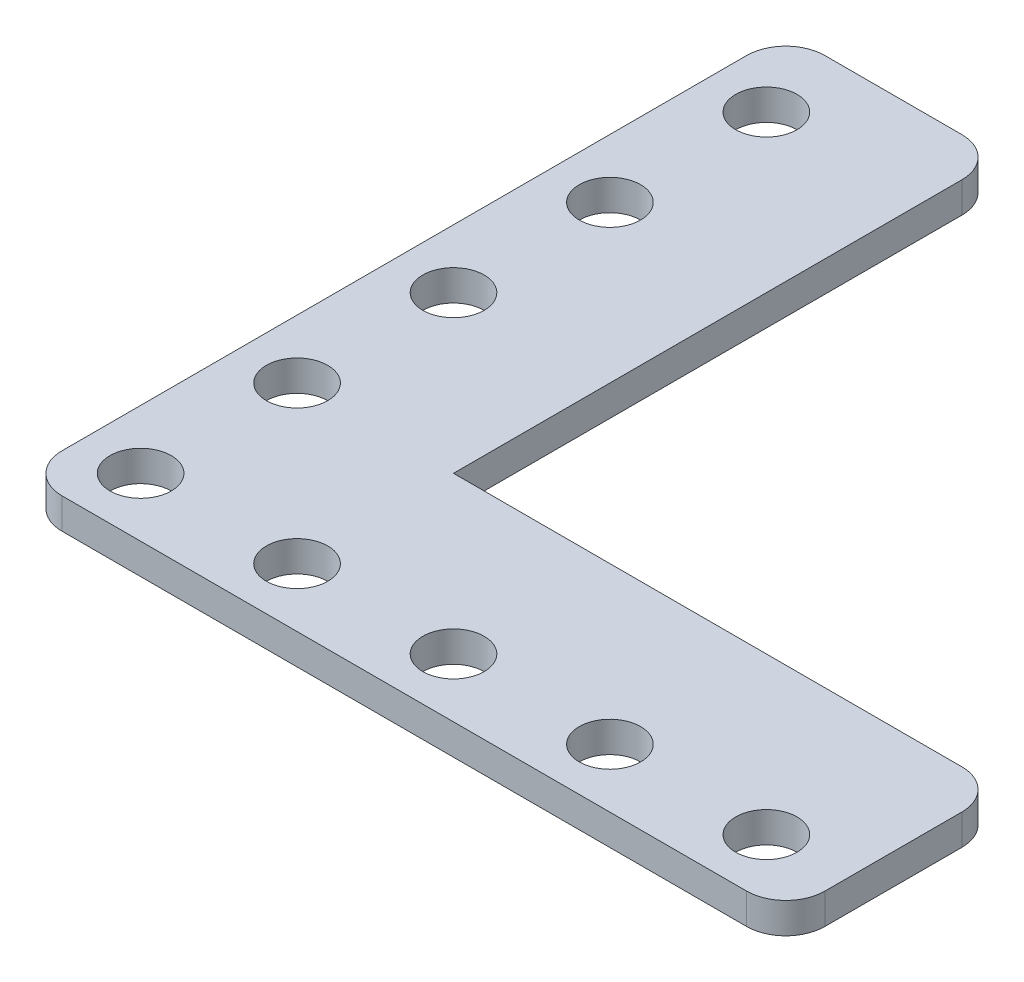
ISO-10303-21;
HEADER;
FILE_DESCRIPTION(('STEP AP214'),'2;1');
FILE_NAME('part.step','',(''),(''),'','','');
FILE_SCHEMA(('AUTOMOTIVE_DESIGN { 1 0 10303 214 1 1 1 1 }'));
ENDSEC;
DATA;
#1=APPLICATION_CONTEXT('core data for automotive mechanical design processes');
#2=APPLICATION_PROTOCOL_DEFINITION('international standard','automotive_design',2000,#1);
#3=PRODUCT_CONTEXT('',#1,'mechanical');
#4=PRODUCT('Part','Part','',(#3));
#5=PRODUCT_RELATED_PRODUCT_CATEGORY('part','',(#4));
#6=PRODUCT_DEFINITION_FORMATION('','',#4);
#7=PRODUCT_DEFINITION_CONTEXT('part definition',#1,'design');
#8=PRODUCT_DEFINITION('design','',#6,#7);
#9=PRODUCT_DEFINITION_SHAPE('','',#8);
#10=(LENGTH_UNIT() NAMED_UNIT(*) SI_UNIT(.MILLI.,.METRE.));
#11=(NAMED_UNIT(*) PLANE_ANGLE_UNIT() SI_UNIT($,.RADIAN.));
#12=(NAMED_UNIT(*) SI_UNIT($,.STERADIAN.) SOLID_ANGLE_UNIT());
#13=UNCERTAINTY_MEASURE_WITH_UNIT(LENGTH_MEASURE(1.E-05),#10,'distance_accuracy_value','');
#14=(GEOMETRIC_REPRESENTATION_CONTEXT(3) GLOBAL_UNCERTAINTY_ASSIGNED_CONTEXT((#13)) GLOBAL_UNIT_ASSIGNED_CONTEXT((#10,
#11,#12)) REPRESENTATION_CONTEXT('',''));
#15=CARTESIAN_POINT('',(0.,0.,0.));
#16=DIRECTION('',(0.,0.,1.));
#17=DIRECTION('',(1.,0.,0.));
#18=AXIS2_PLACEMENT_3D('',#15,#16,#17);
#19=CARTESIAN_POINT('',(38.8874,-53.2892,195.2752));
#20=DIRECTION('',(0.,0.,1.));
#21=DIRECTION('',(1.,0.,0.));
#22=AXIS2_PLACEMENT_3D('',#19,#20,#21);
#23=PLANE('',#22);
#24=DIRECTION('',(1.,0.,0.));
#25=VECTOR('',#24,1.);
#26=CARTESIAN_POINT('',(38.8874,-50.8,195.2752));
#27=LINE('',#26,#25);
#28=CARTESIAN_POINT('',(11.0998,-50.8,195.2752));
#29=VERTEX_POINT('',#28);
#30=CARTESIAN_POINT('',(66.675,-50.8,195.2752));
#31=VERTEX_POINT('',#30);
#32=EDGE_CURVE('E252',#29,#31,#27,.T.);
#33=ORIENTED_EDGE('',*,*,#32,.F.);
#34=DIRECTION('',(0.,1.,0.));
#35=VECTOR('',#34,1.);
#36=CARTESIAN_POINT('',(11.0998,-53.2892,195.2752));
#37=LINE('',#36,#35);
#38=CARTESIAN_POINT('',(11.0998,-53.2892,195.2752));
#39=VERTEX_POINT('',#38);
#40=EDGE_CURVE('E170',#29,#39,#37,.F.);
#41=ORIENTED_EDGE('',*,*,#40,.T.);
#42=DIRECTION('',(1.,0.,0.));
#43=VECTOR('',#42,1.);
#44=CARTESIAN_POINT('',(38.8874,-53.2892,195.2752));
#45=LINE('',#44,#43);
#46=CARTESIAN_POINT('',(66.675,-53.2892,195.2752));
#47=VERTEX_POINT('',#46);
#48=EDGE_CURVE('E216',#39,#47,#45,.T.);
#49=ORIENTED_EDGE('',*,*,#48,.T.);
#50=DIRECTION('',(0.,1.,0.));
#51=VECTOR('',#50,1.);
#52=CARTESIAN_POINT('',(66.675,-53.2892,195.2752));
#53=LINE('',#52,#51);
#54=EDGE_CURVE('E167',#47,#31,#53,.T.);
#55=ORIENTED_EDGE('',*,*,#54,.T.);
#56=EDGE_LOOP('',(#33,#41,#49,#55));
#57=FACE_BOUND('',#56,.T.);
#58=ADVANCED_FACE('F17',(#57),#23,.T.);
#59=CARTESIAN_POINT('',(7.9248,-53.2892,164.3126));
#60=DIRECTION('',(-1.,0.,0.));
#61=DIRECTION('',(0.,0.,1.));
#62=AXIS2_PLACEMENT_3D('',#59,#60,#61);
#63=PLANE('',#62);
#64=DIRECTION('',(0.,0.,1.));
#65=VECTOR('',#64,1.);
#66=CARTESIAN_POINT('',(7.9248,-50.8,164.3126));
#67=LINE('',#66,#65);
#68=CARTESIAN_POINT('',(7.9248,-50.8,136.525));
#69=VERTEX_POINT('',#68);
#70=CARTESIAN_POINT('',(7.9248,-50.8,192.1002));
#71=VERTEX_POINT('',#70);
#72=EDGE_CURVE('E198',#69,#71,#67,.T.);
#73=ORIENTED_EDGE('',*,*,#72,.F.);
#74=DIRECTION('',(0.,1.,0.));
#75=VECTOR('',#74,1.);
#76=CARTESIAN_POINT('',(7.9248,-53.2892,136.525));
#77=LINE('',#76,#75);
#78=CARTESIAN_POINT('',(7.9248,-53.2892,136.525));
#79=VERTEX_POINT('',#78);
#80=EDGE_CURVE('E155',#69,#79,#77,.F.);
#81=ORIENTED_EDGE('',*,*,#80,.T.);
#82=DIRECTION('',(0.,0.,1.));
#83=VECTOR('',#82,1.);
#84=CARTESIAN_POINT('',(7.9248,-53.2892,164.3126));
#85=LINE('',#84,#83);
#86=CARTESIAN_POINT('',(7.9248,-53.2892,192.1002));
#87=VERTEX_POINT('',#86);
#88=EDGE_CURVE('E237',#79,#87,#85,.T.);
#89=ORIENTED_EDGE('',*,*,#88,.T.);
#90=DIRECTION('',(0.,1.,0.));
#91=VECTOR('',#90,1.);
#92=CARTESIAN_POINT('',(7.9248,-53.2892,192.1002));
#93=LINE('',#92,#91);
#94=EDGE_CURVE('E152',#87,#71,#93,.T.);
#95=ORIENTED_EDGE('',*,*,#94,.T.);
#96=EDGE_LOOP('',(#73,#81,#89,#95));
#97=FACE_BOUND('',#96,.T.);
#98=ADVANCED_FACE('F276',(#97),#63,.T.);
#99=CARTESIAN_POINT('',(16.6624,-53.2892,133.35));
#100=DIRECTION('',(0.,0.,-1.));
#101=DIRECTION('',(-1.,0.,0.));
#102=AXIS2_PLACEMENT_3D('',#99,#100,#101);
#103=PLANE('',#102);
#104=DIRECTION('',(-1.,0.,0.));
#105=VECTOR('',#104,1.);
#106=CARTESIAN_POINT('',(16.6624,-53.2892,133.35));
#107=LINE('',#106,#105);
#108=CARTESIAN_POINT('',(22.225,-53.2892,133.35));
#109=VERTEX_POINT('',#108);
#110=CARTESIAN_POINT('',(11.0998,-53.2892,133.35));
#111=VERTEX_POINT('',#110);
#112=EDGE_CURVE('E122',#109,#111,#107,.T.);
#113=ORIENTED_EDGE('',*,*,#112,.T.);
#114=DIRECTION('',(0.,1.,0.));
#115=VECTOR('',#114,1.);
#116=CARTESIAN_POINT('',(11.0998,-53.2892,133.35));
#117=LINE('',#116,#115);
#118=CARTESIAN_POINT('',(11.0998,-50.8,133.35));
#119=VERTEX_POINT('',#118);
#120=EDGE_CURVE('E131',#111,#119,#117,.T.);
#121=ORIENTED_EDGE('',*,*,#120,.T.);
#122=DIRECTION('',(-1.,0.,0.));
#123=VECTOR('',#122,1.);
#124=CARTESIAN_POINT('',(16.6624,-50.8,133.35));
#125=LINE('',#124,#123);
#126=CARTESIAN_POINT('',(22.225,-50.8,133.35));
#127=VERTEX_POINT('',#126);
#128=EDGE_CURVE('E201',#127,#119,#125,.T.);
#129=ORIENTED_EDGE('',*,*,#128,.F.);
#130=DIRECTION('',(0.,1.,0.));
#131=VECTOR('',#130,1.);
#132=CARTESIAN_POINT('',(22.225,-53.2892,133.35));
#133=LINE('',#132,#131);
#134=EDGE_CURVE('E128',#127,#109,#133,.F.);
#135=ORIENTED_EDGE('',*,*,#134,.T.);
#136=EDGE_LOOP('',(#113,#121,#129,#135));
#137=FACE_BOUND('',#136,.T.);
#138=ADVANCED_FACE('F280',(#137),#103,.T.);
#139=CARTESIAN_POINT('',(25.4,-53.2892,12.7));
#140=DIRECTION('',(-1.,0.,0.));
#141=DIRECTION('',(0.,0.,1.));
#142=AXIS2_PLACEMENT_3D('',#139,#140,#141);
#143=PLANE('',#142);
#144=DIRECTION('',(0.,0.,1.));
#145=VECTOR('',#144,1.);
#146=CARTESIAN_POINT('',(25.4,-53.2892,12.7));
#147=LINE('',#146,#145);
#148=CARTESIAN_POINT('',(25.4,-53.2892,136.525));
#149=VERTEX_POINT('',#148);
#150=CARTESIAN_POINT('',(25.4,-53.2892,177.8));
#151=VERTEX_POINT('',#150);
#152=EDGE_CURVE('E111',#149,#151,#147,.T.);
#153=ORIENTED_EDGE('',*,*,#152,.F.);
#154=DIRECTION('',(0.,1.,0.));
#155=VECTOR('',#154,1.);
#156=CARTESIAN_POINT('',(25.4,-50.8,136.525));
#157=LINE('',#156,#155);
#158=CARTESIAN_POINT('',(25.4,-50.8,136.525));
#159=VERTEX_POINT('',#158);
#160=EDGE_CURVE('E165',#149,#159,#157,.T.);
#161=ORIENTED_EDGE('',*,*,#160,.T.);
#162=DIRECTION('',(0.,0.,1.));
#163=VECTOR('',#162,1.);
#164=CARTESIAN_POINT('',(25.4,-50.8,12.7));
#165=LINE('',#164,#163);
#166=CARTESIAN_POINT('',(25.4,-50.8,177.8));
#167=VERTEX_POINT('',#166);
#168=EDGE_CURVE('E126',#159,#167,#165,.T.);
#169=ORIENTED_EDGE('',*,*,#168,.T.);
#170=DIRECTION('',(0.,1.,0.));
#171=VECTOR('',#170,1.);
#172=CARTESIAN_POINT('',(25.4,-53.2892,177.8));
#173=LINE('',#172,#171);
#174=EDGE_CURVE('E105',#151,#167,#173,.T.);
#175=ORIENTED_EDGE('',*,*,#174,.F.);
#176=EDGE_LOOP('',(#153,#161,#169,#175));
#177=FACE_BOUND('',#176,.T.);
#178=ADVANCED_FACE('F124',(#177),#143,.F.);
#179=CARTESIAN_POINT('',(47.625,-53.2892,177.8));
#180=DIRECTION('',(0.,0.,-1.));
#181=DIRECTION('',(-1.,0.,0.));
#182=AXIS2_PLACEMENT_3D('',#179,#180,#181);
#183=PLANE('',#182);
#184=DIRECTION('',(-1.,0.,0.));
#185=VECTOR('',#184,1.);
#186=CARTESIAN_POINT('',(47.625,-50.8,177.8));
#187=LINE('',#186,#185);
#188=CARTESIAN_POINT('',(66.675,-50.8,177.8));
#189=VERTEX_POINT('',#188);
#190=EDGE_CURVE('E184',#189,#167,#187,.T.);
#191=ORIENTED_EDGE('',*,*,#190,.F.);
#192=DIRECTION('',(0.,1.,0.));
#193=VECTOR('',#192,1.);
#194=CARTESIAN_POINT('',(66.675,-53.2892,177.8));
#195=LINE('',#194,#193);
#196=CARTESIAN_POINT('',(66.675,-53.2892,177.8));
#197=VERTEX_POINT('',#196);
#198=EDGE_CURVE('E11',#189,#197,#195,.F.);
#199=ORIENTED_EDGE('',*,*,#198,.T.);
#200=DIRECTION('',(-1.,0.,0.));
#201=VECTOR('',#200,1.);
#202=CARTESIAN_POINT('',(47.625,-53.2892,177.8));
#203=LINE('',#202,#201);
#204=EDGE_CURVE('E100',#197,#151,#203,.T.);
#205=ORIENTED_EDGE('',*,*,#204,.T.);
#206=ORIENTED_EDGE('',*,*,#174,.T.);
#207=EDGE_LOOP('',(#191,#199,#205,#206));
#208=FACE_BOUND('',#207,.T.);
#209=ADVANCED_FACE('F103',(#208),#183,.T.);
#210=CARTESIAN_POINT('',(12.7,-53.2892,177.8));
#211=DIRECTION('',(0.,1.,0.));
#212=DIRECTION('',(0.,0.,1.));
#213=AXIS2_PLACEMENT_3D('',#210,#211,#212);
#214=CYLINDRICAL_SURFACE('',#213,2.4892);
#215=CARTESIAN_POINT('',(12.7,-53.2892,177.8));
#216=DIRECTION('',(0.,-1.,0.));
#217=DIRECTION('',(0.,0.,-1.));
#218=AXIS2_PLACEMENT_3D('',#215,#216,#217);
#219=CIRCLE('',#218,2.4892);
#220=CARTESIAN_POINT('',(12.7,-53.2892,175.3108));
#221=VERTEX_POINT('',#220);
#222=EDGE_CURVE('E134',#221,#221,#219,.T.);
#223=ORIENTED_EDGE('',*,*,#222,.T.);
#224=EDGE_LOOP('',(#223));
#225=FACE_BOUND('',#224,.T.);
#226=CARTESIAN_POINT('',(12.7,-50.8,177.8));
#227=DIRECTION('',(0.,-1.,0.));
#228=DIRECTION('',(0.,0.,-1.));
#229=AXIS2_PLACEMENT_3D('',#226,#227,#228);
#230=CIRCLE('',#229,2.4892);
#231=CARTESIAN_POINT('',(12.7,-50.8,175.3108));
#232=VERTEX_POINT('',#231);
#233=EDGE_CURVE('E211',#232,#232,#230,.T.);
#234=ORIENTED_EDGE('',*,*,#233,.F.);
#235=EDGE_LOOP('',(#234));
#236=FACE_BOUND('',#235,.T.);
#237=ADVANCED_FACE('F331',(#225,#236),#214,.F.);
#238=CARTESIAN_POINT('',(12.7,-53.2892,165.1));
#239=DIRECTION('',(0.,1.,0.));
#240=DIRECTION('',(0.,0.,1.));
#241=AXIS2_PLACEMENT_3D('',#238,#239,#240);
#242=CYLINDRICAL_SURFACE('',#241,2.4892);
#243=CARTESIAN_POINT('',(12.7,-53.2892,165.1));
#244=DIRECTION('',(0.,-1.,0.));
#245=DIRECTION('',(0.,0.,-1.));
#246=AXIS2_PLACEMENT_3D('',#243,#244,#245);
#247=CIRCLE('',#246,2.4892);
#248=CARTESIAN_POINT('',(12.7,-53.2892,162.6108));
#249=VERTEX_POINT('',#248);
#250=EDGE_CURVE('E247',#249,#249,#247,.T.);
#251=ORIENTED_EDGE('',*,*,#250,.T.);
#252=EDGE_LOOP('',(#251));
#253=FACE_BOUND('',#252,.T.);
#254=CARTESIAN_POINT('',(12.7,-50.8,165.1));
#255=DIRECTION('',(0.,-1.,0.));
#256=DIRECTION('',(0.,0.,-1.));
#257=AXIS2_PLACEMENT_3D('',#254,#255,#256);
#258=CIRCLE('',#257,2.4892);
#259=CARTESIAN_POINT('',(12.7,-50.8,162.6108));
#260=VERTEX_POINT('',#259);
#261=EDGE_CURVE('E209',#260,#260,#258,.T.);
#262=ORIENTED_EDGE('',*,*,#261,.F.);
#263=EDGE_LOOP('',(#262));
#264=FACE_BOUND('',#263,.T.);
#265=ADVANCED_FACE('F335',(#253,#264),#242,.F.);
#266=CARTESIAN_POINT('',(12.7,-53.2892,152.4));
#267=DIRECTION('',(0.,1.,0.));
#268=DIRECTION('',(0.,0.,1.));
#269=AXIS2_PLACEMENT_3D('',#266,#267,#268);
#270=CYLINDRICAL_SURFACE('',#269,2.4892);
#271=CARTESIAN_POINT('',(12.7,-53.2892,152.4));
#272=DIRECTION('',(0.,-1.,0.));
#273=DIRECTION('',(0.,0.,-1.));
#274=AXIS2_PLACEMENT_3D('',#271,#272,#273);
#275=CIRCLE('',#274,2.4892);
#276=CARTESIAN_POINT('',(12.7,-53.2892,149.9108));
#277=VERTEX_POINT('',#276);
#278=EDGE_CURVE('E244',#277,#277,#275,.T.);
#279=ORIENTED_EDGE('',*,*,#278,.T.);
#280=EDGE_LOOP('',(#279));
#281=FACE_BOUND('',#280,.T.);
#282=CARTESIAN_POINT('',(12.7,-50.8,152.4));
#283=DIRECTION('',(0.,-1.,0.));
#284=DIRECTION('',(0.,0.,-1.));
#285=AXIS2_PLACEMENT_3D('',#282,#283,#284);
#286=CIRCLE('',#285,2.4892);
#287=CARTESIAN_POINT('',(12.7,-50.8,149.9108));
#288=VERTEX_POINT('',#287);
#289=EDGE_CURVE('E206',#288,#288,#286,.T.);
#290=ORIENTED_EDGE('',*,*,#289,.F.);
#291=EDGE_LOOP('',(#290));
#292=FACE_BOUND('',#291,.T.);
#293=ADVANCED_FACE('F341',(#281,#292),#270,.F.);
#294=CARTESIAN_POINT('',(12.7,-53.2892,139.7));
#295=DIRECTION('',(0.,1.,0.));
#296=DIRECTION('',(0.,0.,1.));
#297=AXIS2_PLACEMENT_3D('',#294,#295,#296);
#298=CYLINDRICAL_SURFACE('',#297,2.4892);
#299=CARTESIAN_POINT('',(12.7,-53.2892,139.7));
#300=DIRECTION('',(0.,-1.,0.));
#301=DIRECTION('',(0.,0.,-1.));
#302=AXIS2_PLACEMENT_3D('',#299,#300,#301);
#303=CIRCLE('',#302,2.4892);
#304=CARTESIAN_POINT('',(12.7,-53.2892,137.2108));
#305=VERTEX_POINT('',#304);
#306=EDGE_CURVE('E121',#305,#305,#303,.T.);
#307=ORIENTED_EDGE('',*,*,#306,.T.);
#308=EDGE_LOOP('',(#307));
#309=FACE_BOUND('',#308,.T.);
#310=CARTESIAN_POINT('',(12.7,-50.8,139.7));
#311=DIRECTION('',(0.,-1.,0.));
#312=DIRECTION('',(0.,0.,-1.));
#313=AXIS2_PLACEMENT_3D('',#310,#311,#312);
#314=CIRCLE('',#313,2.4892);
#315=CARTESIAN_POINT('',(12.7,-50.8,137.2108));
#316=VERTEX_POINT('',#315);
#317=EDGE_CURVE('E203',#316,#316,#314,.T.);
#318=ORIENTED_EDGE('',*,*,#317,.F.);
#319=EDGE_LOOP('',(#318));
#320=FACE_BOUND('',#319,.T.);
#321=ADVANCED_FACE('F326',(#309,#320),#298,.F.);
#322=CARTESIAN_POINT('',(63.5,-53.2892,190.5));
#323=DIRECTION('',(0.,1.,0.));
#324=DIRECTION('',(0.,0.,1.));
#325=AXIS2_PLACEMENT_3D('',#322,#323,#324);
#326=CYLINDRICAL_SURFACE('',#325,2.4892);
#327=CARTESIAN_POINT('',(63.5,-53.2892,190.5));
#328=DIRECTION('',(0.,-1.,0.));
#329=DIRECTION('',(0.,0.,-1.));
#330=AXIS2_PLACEMENT_3D('',#327,#328,#329);
#331=CIRCLE('',#330,2.4892);
#332=CARTESIAN_POINT('',(63.5,-53.2892,188.0108));
#333=VERTEX_POINT('',#332);
#334=EDGE_CURVE('E234',#333,#333,#331,.T.);
#335=ORIENTED_EDGE('',*,*,#334,.T.);
#336=EDGE_LOOP('',(#335));
#337=FACE_BOUND('',#336,.T.);
#338=CARTESIAN_POINT('',(63.5,-50.8,190.5));
#339=DIRECTION('',(0.,-1.,0.));
#340=DIRECTION('',(0.,0.,-1.));
#341=AXIS2_PLACEMENT_3D('',#338,#339,#340);
#342=CIRCLE('',#341,2.4892);
#343=CARTESIAN_POINT('',(63.5,-50.8,188.0108));
#344=VERTEX_POINT('',#343);
#345=EDGE_CURVE('E195',#344,#344,#342,.T.);
#346=ORIENTED_EDGE('',*,*,#345,.F.);
#347=EDGE_LOOP('',(#346));
#348=FACE_BOUND('',#347,.T.);
#349=ADVANCED_FACE('F323',(#337,#348),#326,.F.);
#350=CARTESIAN_POINT('',(50.8,-53.2892,190.5));
#351=DIRECTION('',(0.,1.,0.));
#352=DIRECTION('',(0.,0.,1.));
#353=AXIS2_PLACEMENT_3D('',#350,#351,#352);
#354=CYLINDRICAL_SURFACE('',#353,2.4892);
#355=CARTESIAN_POINT('',(50.8,-53.2892,190.5));
#356=DIRECTION('',(0.,-1.,0.));
#357=DIRECTION('',(0.,0.,-1.));
#358=AXIS2_PLACEMENT_3D('',#355,#356,#357);
#359=CIRCLE('',#358,2.4892);
#360=CARTESIAN_POINT('',(50.8,-53.2892,188.0108));
#361=VERTEX_POINT('',#360);
#362=EDGE_CURVE('E231',#361,#361,#359,.T.);
#363=ORIENTED_EDGE('',*,*,#362,.T.);
#364=EDGE_LOOP('',(#363));
#365=FACE_BOUND('',#364,.T.);
#366=CARTESIAN_POINT('',(50.8,-50.8,190.5));
#367=DIRECTION('',(0.,-1.,0.));
#368=DIRECTION('',(0.,0.,-1.));
#369=AXIS2_PLACEMENT_3D('',#366,#367,#368);
#370=CIRCLE('',#369,2.4892);
#371=CARTESIAN_POINT('',(50.8,-50.8,188.0108));
#372=VERTEX_POINT('',#371);
#373=EDGE_CURVE('E187',#372,#372,#370,.T.);
#374=ORIENTED_EDGE('',*,*,#373,.F.);
#375=EDGE_LOOP('',(#374));
#376=FACE_BOUND('',#375,.T.);
#377=ADVANCED_FACE('F270',(#365,#376),#354,.F.);
#378=CARTESIAN_POINT('',(38.1,-53.2892,190.5));
#379=DIRECTION('',(0.,1.,0.));
#380=DIRECTION('',(0.,0.,1.));
#381=AXIS2_PLACEMENT_3D('',#378,#379,#380);
#382=CYLINDRICAL_SURFACE('',#381,2.4892);
#383=CARTESIAN_POINT('',(38.1,-53.2892,190.5));
#384=DIRECTION('',(0.,-1.,0.));
#385=DIRECTION('',(0.,0.,-1.));
#386=AXIS2_PLACEMENT_3D('',#383,#384,#385);
#387=CIRCLE('',#386,2.4892);
#388=CARTESIAN_POINT('',(38.1,-53.2892,188.0108));
#389=VERTEX_POINT('',#388);
#390=EDGE_CURVE('E228',#389,#389,#387,.T.);
#391=ORIENTED_EDGE('',*,*,#390,.T.);
#392=EDGE_LOOP('',(#391));
#393=FACE_BOUND('',#392,.T.);
#394=CARTESIAN_POINT('',(38.1,-50.8,190.5));
#395=DIRECTION('',(0.,-1.,0.));
#396=DIRECTION('',(0.,0.,-1.));
#397=AXIS2_PLACEMENT_3D('',#394,#395,#396);
#398=CIRCLE('',#397,2.4892);
#399=CARTESIAN_POINT('',(38.1,-50.8,188.0108));
#400=VERTEX_POINT('',#399);
#401=EDGE_CURVE('E183',#400,#400,#398,.T.);
#402=ORIENTED_EDGE('',*,*,#401,.F.);
#403=EDGE_LOOP('',(#402));
#404=FACE_BOUND('',#403,.T.);
#405=ADVANCED_FACE('F260',(#393,#404),#382,.F.);
#406=CARTESIAN_POINT('',(25.4,-53.2892,190.5));
#407=DIRECTION('',(0.,1.,0.));
#408=DIRECTION('',(0.,0.,1.));
#409=AXIS2_PLACEMENT_3D('',#406,#407,#408);
#410=CYLINDRICAL_SURFACE('',#409,2.4892);
#411=CARTESIAN_POINT('',(25.4,-53.2892,190.5));
#412=DIRECTION('',(0.,-1.,0.));
#413=DIRECTION('',(0.,0.,-1.));
#414=AXIS2_PLACEMENT_3D('',#411,#412,#413);
#415=CIRCLE('',#414,2.4892);
#416=CARTESIAN_POINT('',(25.4,-53.2892,188.0108));
#417=VERTEX_POINT('',#416);
#418=EDGE_CURVE('E108',#417,#417,#415,.T.);
#419=ORIENTED_EDGE('',*,*,#418,.T.);
#420=EDGE_LOOP('',(#419));
#421=FACE_BOUND('',#420,.T.);
#422=CARTESIAN_POINT('',(25.4,-50.8,190.5));
#423=DIRECTION('',(0.,-1.,0.));
#424=DIRECTION('',(0.,0.,-1.));
#425=AXIS2_PLACEMENT_3D('',#422,#423,#424);
#426=CIRCLE('',#425,2.4892);
#427=CARTESIAN_POINT('',(25.4,-50.8,188.0108));
#428=VERTEX_POINT('',#427);
#429=EDGE_CURVE('E189',#428,#428,#426,.T.);
#430=ORIENTED_EDGE('',*,*,#429,.F.);
#431=EDGE_LOOP('',(#430));
#432=FACE_BOUND('',#431,.T.);
#433=ADVANCED_FACE('F258',(#421,#432),#410,.F.);
#434=CARTESIAN_POINT('',(69.85,-53.2892,186.5376));
#435=DIRECTION('',(1.,0.,0.));
#436=DIRECTION('',(0.,0.,-1.));
#437=AXIS2_PLACEMENT_3D('',#434,#435,#436);
#438=PLANE('',#437);
#439=DIRECTION('',(0.,0.,-1.));
#440=VECTOR('',#439,1.);
#441=CARTESIAN_POINT('',(69.85,-53.2892,186.5376));
#442=LINE('',#441,#440);
#443=CARTESIAN_POINT('',(69.85,-53.2892,192.1002));
#444=VERTEX_POINT('',#443);
#445=CARTESIAN_POINT('',(69.85,-53.2892,180.975));
#446=VERTEX_POINT('',#445);
#447=EDGE_CURVE('E107',#444,#446,#442,.T.);
#448=ORIENTED_EDGE('',*,*,#447,.T.);
#449=DIRECTION('',(0.,1.,0.));
#450=VECTOR('',#449,1.);
#451=CARTESIAN_POINT('',(69.85,-53.2892,180.975));
#452=LINE('',#451,#450);
#453=CARTESIAN_POINT('',(69.85,-50.8,180.975));
#454=VERTEX_POINT('',#453);
#455=EDGE_CURVE('E25',#446,#454,#452,.T.);
#456=ORIENTED_EDGE('',*,*,#455,.T.);
#457=DIRECTION('',(0.,0.,-1.));
#458=VECTOR('',#457,1.);
#459=CARTESIAN_POINT('',(69.85,-50.8,186.5376));
#460=LINE('',#459,#458);
#461=CARTESIAN_POINT('',(69.85,-50.8,192.1002));
#462=VERTEX_POINT('',#461);
#463=EDGE_CURVE('E176',#462,#454,#460,.T.);
#464=ORIENTED_EDGE('',*,*,#463,.F.);
#465=DIRECTION('',(0.,1.,0.));
#466=VECTOR('',#465,1.);
#467=CARTESIAN_POINT('',(69.85,-53.2892,192.1002));
#468=LINE('',#467,#466);
#469=EDGE_CURVE('E39',#462,#444,#468,.F.);
#470=ORIENTED_EDGE('',*,*,#469,.T.);
#471=EDGE_LOOP('',(#448,#456,#464,#470));
#472=FACE_BOUND('',#471,.T.);
#473=ADVANCED_FACE('F175',(#472),#438,.T.);
#474=CARTESIAN_POINT('',(12.7,-53.2892,190.5));
#475=DIRECTION('',(0.,1.,0.));
#476=DIRECTION('',(0.,0.,1.));
#477=AXIS2_PLACEMENT_3D('',#474,#475,#476);
#478=CYLINDRICAL_SURFACE('',#477,2.4892);
#479=CARTESIAN_POINT('',(12.7,-53.2892,190.5));
#480=DIRECTION('',(0.,-1.,0.));
#481=DIRECTION('',(0.,0.,-1.));
#482=AXIS2_PLACEMENT_3D('',#479,#480,#481);
#483=CIRCLE('',#482,2.4892);
#484=CARTESIAN_POINT('',(12.7,-53.2892,188.0108));
#485=VERTEX_POINT('',#484);
#486=EDGE_CURVE('E129',#485,#485,#483,.T.);
#487=ORIENTED_EDGE('',*,*,#486,.T.);
#488=EDGE_LOOP('',(#487));
#489=FACE_BOUND('',#488,.T.);
#490=CARTESIAN_POINT('',(12.7,-50.8,190.5));
#491=DIRECTION('',(0.,-1.,0.));
#492=DIRECTION('',(0.,0.,-1.));
#493=AXIS2_PLACEMENT_3D('',#490,#491,#492);
#494=CIRCLE('',#493,2.4892);
#495=CARTESIAN_POINT('',(12.7,-50.8,188.0108));
#496=VERTEX_POINT('',#495);
#497=EDGE_CURVE('E137',#496,#496,#494,.T.);
#498=ORIENTED_EDGE('',*,*,#497,.F.);
#499=EDGE_LOOP('',(#498));
#500=FACE_BOUND('',#499,.T.);
#501=ADVANCED_FACE('F268',(#489,#500),#478,.F.);
#502=CARTESIAN_POINT('',(134.5946,-53.2892,101.6));
#503=DIRECTION('',(0.,-1.,0.));
#504=DIRECTION('',(1.,0.,0.));
#505=AXIS2_PLACEMENT_3D('',#502,#503,#504);
#506=PLANE('',#505);
#507=ORIENTED_EDGE('',*,*,#88,.F.);
#508=CARTESIAN_POINT('',(11.0998,-53.2892,136.525));
#509=DIRECTION('',(0.,-1.,0.));
#510=DIRECTION('',(0.,0.,-1.));
#511=AXIS2_PLACEMENT_3D('',#508,#509,#510);
#512=CIRCLE('',#511,3.175);
#513=EDGE_CURVE('E163',#79,#111,#512,.T.);
#514=ORIENTED_EDGE('',*,*,#513,.T.);
#515=ORIENTED_EDGE('',*,*,#112,.F.);
#516=CARTESIAN_POINT('',(22.225,-53.2892,136.525));
#517=DIRECTION('',(0.,-1.,0.));
#518=DIRECTION('',(0.,0.,-1.));
#519=AXIS2_PLACEMENT_3D('',#516,#517,#518);
#520=CIRCLE('',#519,3.175);
#521=EDGE_CURVE('E117',#109,#149,#520,.T.);
#522=ORIENTED_EDGE('',*,*,#521,.T.);
#523=ORIENTED_EDGE('',*,*,#152,.T.);
#524=ORIENTED_EDGE('',*,*,#204,.F.);
#525=CARTESIAN_POINT('',(66.675,-53.2892,180.975));
#526=DIRECTION('',(0.,-1.,0.));
#527=DIRECTION('',(0.,0.,-1.));
#528=AXIS2_PLACEMENT_3D('',#525,#526,#527);
#529=CIRCLE('',#528,3.175);
#530=EDGE_CURVE('E32',#197,#446,#529,.T.);
#531=ORIENTED_EDGE('',*,*,#530,.T.);
#532=ORIENTED_EDGE('',*,*,#447,.F.);
#533=CARTESIAN_POINT('',(66.675,-53.2892,192.1002));
#534=DIRECTION('',(0.,-1.,0.));
#535=DIRECTION('',(0.,0.,-1.));
#536=AXIS2_PLACEMENT_3D('',#533,#534,#535);
#537=CIRCLE('',#536,3.175);
#538=EDGE_CURVE('E157',#444,#47,#537,.T.);
#539=ORIENTED_EDGE('',*,*,#538,.T.);
#540=ORIENTED_EDGE('',*,*,#48,.F.);
#541=CARTESIAN_POINT('',(11.0998,-53.2892,192.1002));
#542=DIRECTION('',(0.,-1.,0.));
#543=DIRECTION('',(0.,0.,-1.));
#544=AXIS2_PLACEMENT_3D('',#541,#542,#543);
#545=CIRCLE('',#544,3.175);
#546=EDGE_CURVE('E160',#39,#87,#545,.T.);
#547=ORIENTED_EDGE('',*,*,#546,.T.);
#548=EDGE_LOOP('',(#507,#514,#515,#522,#523,#524,#531,#532,#539,#540,#547));
#549=FACE_BOUND('',#548,.T.);
#550=ORIENTED_EDGE('',*,*,#418,.F.);
#551=EDGE_LOOP('',(#550));
#552=FACE_BOUND('',#551,.T.);
#553=ORIENTED_EDGE('',*,*,#390,.F.);
#554=EDGE_LOOP('',(#553));
#555=FACE_BOUND('',#554,.T.);
#556=ORIENTED_EDGE('',*,*,#362,.F.);
#557=EDGE_LOOP('',(#556));
#558=FACE_BOUND('',#557,.T.);
#559=ORIENTED_EDGE('',*,*,#334,.F.);
#560=EDGE_LOOP('',(#559));
#561=FACE_BOUND('',#560,.T.);
#562=ORIENTED_EDGE('',*,*,#306,.F.);
#563=EDGE_LOOP('',(#562));
#564=FACE_BOUND('',#563,.T.);
#565=ORIENTED_EDGE('',*,*,#278,.F.);
#566=EDGE_LOOP('',(#565));
#567=FACE_BOUND('',#566,.T.);
#568=ORIENTED_EDGE('',*,*,#250,.F.);
#569=EDGE_LOOP('',(#568));
#570=FACE_BOUND('',#569,.T.);
#571=ORIENTED_EDGE('',*,*,#222,.F.);
#572=EDGE_LOOP('',(#571));
#573=FACE_BOUND('',#572,.T.);
#574=ORIENTED_EDGE('',*,*,#486,.F.);
#575=EDGE_LOOP('',(#574));
#576=FACE_BOUND('',#575,.T.);
#577=ADVANCED_FACE('F113',(#549,#552,#555,#558,#561,#564,#567,#570,#573,#576),#506,.T.);
#578=CARTESIAN_POINT('',(134.5946,-50.8,101.6));
#579=DIRECTION('',(0.,-1.,0.));
#580=DIRECTION('',(1.,0.,0.));
#581=AXIS2_PLACEMENT_3D('',#578,#579,#580);
#582=PLANE('',#581);
#583=ORIENTED_EDGE('',*,*,#128,.T.);
#584=CARTESIAN_POINT('',(11.0998,-50.8,136.525));
#585=DIRECTION('',(0.,-1.,0.));
#586=DIRECTION('',(0.,0.,-1.));
#587=AXIS2_PLACEMENT_3D('',#584,#585,#586);
#588=CIRCLE('',#587,3.175);
#589=EDGE_CURVE('E150',#119,#69,#588,.F.);
#590=ORIENTED_EDGE('',*,*,#589,.T.);
#591=ORIENTED_EDGE('',*,*,#72,.T.);
#592=CARTESIAN_POINT('',(11.0998,-50.8,192.1002));
#593=DIRECTION('',(0.,-1.,0.));
#594=DIRECTION('',(0.,0.,-1.));
#595=AXIS2_PLACEMENT_3D('',#592,#593,#594);
#596=CIRCLE('',#595,3.175);
#597=EDGE_CURVE('E146',#71,#29,#596,.F.);
#598=ORIENTED_EDGE('',*,*,#597,.T.);
#599=ORIENTED_EDGE('',*,*,#32,.T.);
#600=CARTESIAN_POINT('',(66.675,-50.8,192.1002));
#601=DIRECTION('',(0.,-1.,0.));
#602=DIRECTION('',(0.,0.,-1.));
#603=AXIS2_PLACEMENT_3D('',#600,#601,#602);
#604=CIRCLE('',#603,3.175);
#605=EDGE_CURVE('E142',#31,#462,#604,.F.);
#606=ORIENTED_EDGE('',*,*,#605,.T.);
#607=ORIENTED_EDGE('',*,*,#463,.T.);
#608=CARTESIAN_POINT('',(66.675,-50.8,180.975));
#609=DIRECTION('',(0.,-1.,0.));
#610=DIRECTION('',(0.,0.,-1.));
#611=AXIS2_PLACEMENT_3D('',#608,#609,#610);
#612=CIRCLE('',#611,3.175);
#613=EDGE_CURVE('E144',#454,#189,#612,.F.);
#614=ORIENTED_EDGE('',*,*,#613,.T.);
#615=ORIENTED_EDGE('',*,*,#190,.T.);
#616=ORIENTED_EDGE('',*,*,#168,.F.);
#617=CARTESIAN_POINT('',(22.225,-50.8,136.525));
#618=DIRECTION('',(0.,-1.,0.));
#619=DIRECTION('',(0.,0.,-1.));
#620=AXIS2_PLACEMENT_3D('',#617,#618,#619);
#621=CIRCLE('',#620,3.175);
#622=EDGE_CURVE('E148',#159,#127,#621,.F.);
#623=ORIENTED_EDGE('',*,*,#622,.T.);
#624=EDGE_LOOP('',(#583,#590,#591,#598,#599,#606,#607,#614,#615,#616,#623));
#625=FACE_BOUND('',#624,.T.);
#626=ORIENTED_EDGE('',*,*,#429,.T.);
#627=EDGE_LOOP('',(#626));
#628=FACE_BOUND('',#627,.T.);
#629=ORIENTED_EDGE('',*,*,#401,.T.);
#630=EDGE_LOOP('',(#629));
#631=FACE_BOUND('',#630,.T.);
#632=ORIENTED_EDGE('',*,*,#373,.T.);
#633=EDGE_LOOP('',(#632));
#634=FACE_BOUND('',#633,.T.);
#635=ORIENTED_EDGE('',*,*,#345,.T.);
#636=EDGE_LOOP('',(#635));
#637=FACE_BOUND('',#636,.T.);
#638=ORIENTED_EDGE('',*,*,#317,.T.);
#639=EDGE_LOOP('',(#638));
#640=FACE_BOUND('',#639,.T.);
#641=ORIENTED_EDGE('',*,*,#289,.T.);
#642=EDGE_LOOP('',(#641));
#643=FACE_BOUND('',#642,.T.);
#644=ORIENTED_EDGE('',*,*,#261,.T.);
#645=EDGE_LOOP('',(#644));
#646=FACE_BOUND('',#645,.T.);
#647=ORIENTED_EDGE('',*,*,#233,.T.);
#648=EDGE_LOOP('',(#647));
#649=FACE_BOUND('',#648,.T.);
#650=ORIENTED_EDGE('',*,*,#497,.T.);
#651=EDGE_LOOP('',(#650));
#652=FACE_BOUND('',#651,.T.);
#653=ADVANCED_FACE('F180',(#625,#628,#631,#634,#637,#640,#643,#646,#649,#652),#582,.F.);
#654=CARTESIAN_POINT('',(11.0998,-53.2892,136.525));
#655=DIRECTION('',(0.,1.,0.));
#656=DIRECTION('',(0.,0.,1.));
#657=AXIS2_PLACEMENT_3D('',#654,#655,#656);
#658=CYLINDRICAL_SURFACE('',#657,3.175);
#659=ORIENTED_EDGE('',*,*,#513,.F.);
#660=ORIENTED_EDGE('',*,*,#80,.F.);
#661=ORIENTED_EDGE('',*,*,#589,.F.);
#662=ORIENTED_EDGE('',*,*,#120,.F.);
#663=EDGE_LOOP('',(#659,#660,#661,#662));
#664=FACE_BOUND('',#663,.T.);
#665=ADVANCED_FACE('F285',(#664),#658,.T.);
#666=CARTESIAN_POINT('',(22.225,-53.2892,136.525));
#667=DIRECTION('',(0.,-1.,0.));
#668=DIRECTION('',(0.,0.,-1.));
#669=AXIS2_PLACEMENT_3D('',#666,#667,#668);
#670=CYLINDRICAL_SURFACE('',#669,3.175);
#671=ORIENTED_EDGE('',*,*,#521,.F.);
#672=ORIENTED_EDGE('',*,*,#134,.F.);
#673=ORIENTED_EDGE('',*,*,#622,.F.);
#674=ORIENTED_EDGE('',*,*,#160,.F.);
#675=EDGE_LOOP('',(#671,#672,#673,#674));
#676=FACE_BOUND('',#675,.T.);
#677=ADVANCED_FACE('F288',(#676),#670,.T.);
#678=CARTESIAN_POINT('',(11.0998,-53.2892,192.1002));
#679=DIRECTION('',(0.,1.,0.));
#680=DIRECTION('',(0.,0.,1.));
#681=AXIS2_PLACEMENT_3D('',#678,#679,#680);
#682=CYLINDRICAL_SURFACE('',#681,3.175);
#683=ORIENTED_EDGE('',*,*,#546,.F.);
#684=ORIENTED_EDGE('',*,*,#40,.F.);
#685=ORIENTED_EDGE('',*,*,#597,.F.);
#686=ORIENTED_EDGE('',*,*,#94,.F.);
#687=EDGE_LOOP('',(#683,#684,#685,#686));
#688=FACE_BOUND('',#687,.T.);
#689=ADVANCED_FACE('F292',(#688),#682,.T.);
#690=CARTESIAN_POINT('',(66.675,-53.2892,180.975));
#691=DIRECTION('',(0.,1.,0.));
#692=DIRECTION('',(0.,0.,1.));
#693=AXIS2_PLACEMENT_3D('',#690,#691,#692);
#694=CYLINDRICAL_SURFACE('',#693,3.175);
#695=ORIENTED_EDGE('',*,*,#530,.F.);
#696=ORIENTED_EDGE('',*,*,#198,.F.);
#697=ORIENTED_EDGE('',*,*,#613,.F.);
#698=ORIENTED_EDGE('',*,*,#455,.F.);
#699=EDGE_LOOP('',(#695,#696,#697,#698));
#700=FACE_BOUND('',#699,.T.);
#701=ADVANCED_FACE('F295',(#700),#694,.T.);
#702=CARTESIAN_POINT('',(66.675,-53.2892,192.1002));
#703=DIRECTION('',(0.,1.,0.));
#704=DIRECTION('',(0.,0.,1.));
#705=AXIS2_PLACEMENT_3D('',#702,#703,#704);
#706=CYLINDRICAL_SURFACE('',#705,3.175);
#707=ORIENTED_EDGE('',*,*,#538,.F.);
#708=ORIENTED_EDGE('',*,*,#469,.F.);
#709=ORIENTED_EDGE('',*,*,#605,.F.);
#710=ORIENTED_EDGE('',*,*,#54,.F.);
#711=EDGE_LOOP('',(#707,#708,#709,#710));
#712=FACE_BOUND('',#711,.T.);
#713=ADVANCED_FACE('F19',(#712),#706,.T.);
#714=CLOSED_SHELL('',(#58,#98,#138,#178,#209,#237,#265,#293,#321,#349,#377,#405,#433,#473,#501,
#577,#653,#665,#677,#689,#701,#713));
#715=MANIFOLD_SOLID_BREP('B1',#714);
#716=ADVANCED_BREP_SHAPE_REPRESENTATION('',(#18,#715),#14);
#717=SHAPE_DEFINITION_REPRESENTATION(#9,#716);
ENDSEC;
END-ISO-10303-21;
